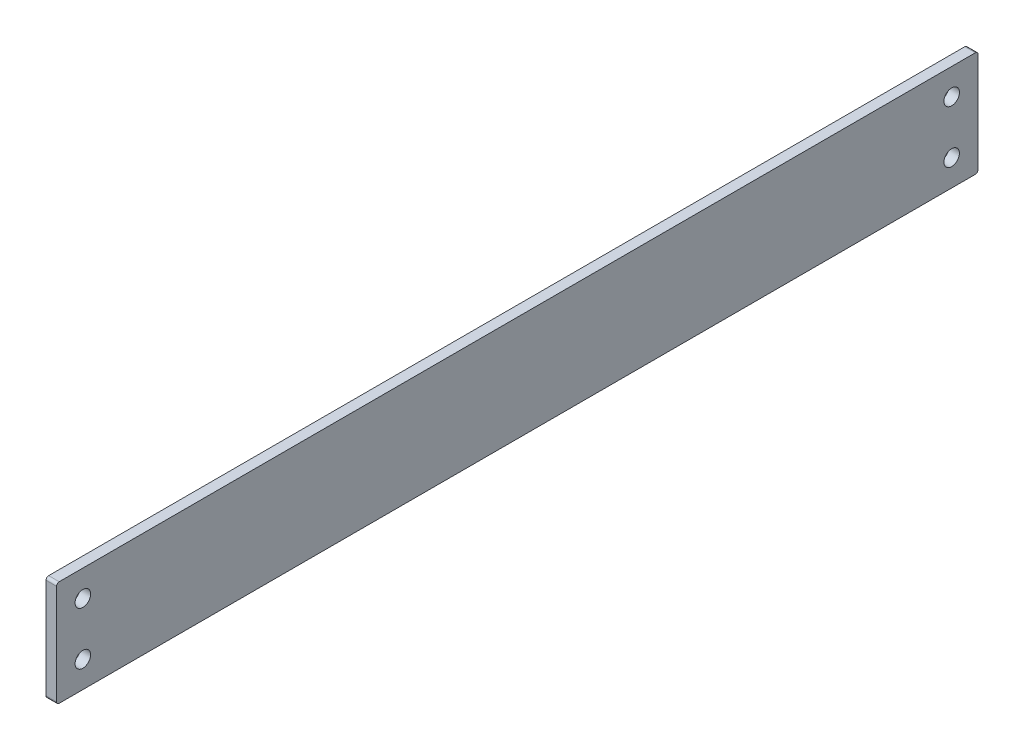
ISO-10303-21;
HEADER;
FILE_DESCRIPTION(('STEP AP214'),'2;1');
FILE_NAME('part.step','',(''),(''),'','','');
FILE_SCHEMA(('AUTOMOTIVE_DESIGN { 1 0 10303 214 1 1 1 1 }'));
ENDSEC;
DATA;
#1=APPLICATION_CONTEXT('core data for automotive mechanical design processes');
#2=APPLICATION_PROTOCOL_DEFINITION('international standard','automotive_design',2000,#1);
#3=PRODUCT_CONTEXT('',#1,'mechanical');
#4=PRODUCT('Part','Part','',(#3));
#5=PRODUCT_RELATED_PRODUCT_CATEGORY('part','',(#4));
#6=PRODUCT_DEFINITION_FORMATION('','',#4);
#7=PRODUCT_DEFINITION_CONTEXT('part definition',#1,'design');
#8=PRODUCT_DEFINITION('design','',#6,#7);
#9=PRODUCT_DEFINITION_SHAPE('','',#8);
#10=(LENGTH_UNIT() NAMED_UNIT(*) SI_UNIT(.MILLI.,.METRE.));
#11=(NAMED_UNIT(*) PLANE_ANGLE_UNIT() SI_UNIT($,.RADIAN.));
#12=(NAMED_UNIT(*) SI_UNIT($,.STERADIAN.) SOLID_ANGLE_UNIT());
#13=UNCERTAINTY_MEASURE_WITH_UNIT(LENGTH_MEASURE(1.E-05),#10,'distance_accuracy_value','');
#14=(GEOMETRIC_REPRESENTATION_CONTEXT(3) GLOBAL_UNCERTAINTY_ASSIGNED_CONTEXT((#13)) GLOBAL_UNIT_ASSIGNED_CONTEXT((#10,
#11,#12)) REPRESENTATION_CONTEXT('',''));
#15=CARTESIAN_POINT('',(0.,0.,0.));
#16=DIRECTION('',(0.,0.,1.));
#17=DIRECTION('',(1.,0.,0.));
#18=AXIS2_PLACEMENT_3D('',#15,#16,#17);
#19=CARTESIAN_POINT('',(4.,0.,0.));
#20=DIRECTION('',(-1.,0.,0.));
#21=DIRECTION('',(0.,0.,1.));
#22=AXIS2_PLACEMENT_3D('',#19,#20,#21);
#23=PLANE('',#22);
#24=DIRECTION('',(0.,0.,-1.));
#25=VECTOR('',#24,1.);
#26=CARTESIAN_POINT('',(4.,0.,0.));
#27=LINE('',#26,#25);
#28=CARTESIAN_POINT('',(4.,0.,-1.));
#29=VERTEX_POINT('',#28);
#30=CARTESIAN_POINT('',(4.,0.,-349.));
#31=VERTEX_POINT('',#30);
#32=EDGE_CURVE('E173',#29,#31,#27,.T.);
#33=ORIENTED_EDGE('',*,*,#32,.T.);
#34=CARTESIAN_POINT('',(4.,1.00000000000004,-349.));
#35=DIRECTION('',(-1.,0.,0.));
#36=DIRECTION('',(0.,0.,1.));
#37=AXIS2_PLACEMENT_3D('',#34,#35,#36);
#38=CIRCLE('',#37,1.);
#39=CARTESIAN_POINT('',(4.,1.00000000000004,-350.));
#40=VERTEX_POINT('',#39);
#41=EDGE_CURVE('E150',#31,#40,#38,.F.);
#42=ORIENTED_EDGE('',*,*,#41,.T.);
#43=DIRECTION('',(0.,1.,0.));
#44=VECTOR('',#43,1.);
#45=CARTESIAN_POINT('',(4.,0.,-350.));
#46=LINE('',#45,#44);
#47=CARTESIAN_POINT('',(4.,39.,-350.));
#48=VERTEX_POINT('',#47);
#49=EDGE_CURVE('E120',#40,#48,#46,.T.);
#50=ORIENTED_EDGE('',*,*,#49,.T.);
#51=CARTESIAN_POINT('',(4.,39.,-349.));
#52=DIRECTION('',(-1.,0.,0.));
#53=DIRECTION('',(0.,0.,1.));
#54=AXIS2_PLACEMENT_3D('',#51,#52,#53);
#55=CIRCLE('',#54,1.);
#56=CARTESIAN_POINT('',(4.,40.,-349.));
#57=VERTEX_POINT('',#56);
#58=EDGE_CURVE('E57',#48,#57,#55,.F.);
#59=ORIENTED_EDGE('',*,*,#58,.T.);
#60=DIRECTION('',(0.,0.,1.));
#61=VECTOR('',#60,1.);
#62=CARTESIAN_POINT('',(4.,40.,0.));
#63=LINE('',#62,#61);
#64=CARTESIAN_POINT('',(4.,40.,-1.));
#65=VERTEX_POINT('',#64);
#66=EDGE_CURVE('E136',#57,#65,#63,.T.);
#67=ORIENTED_EDGE('',*,*,#66,.T.);
#68=CARTESIAN_POINT('',(4.,39.,-1.));
#69=DIRECTION('',(-1.,0.,0.));
#70=DIRECTION('',(0.,0.,1.));
#71=AXIS2_PLACEMENT_3D('',#68,#69,#70);
#72=CIRCLE('',#71,1.);
#73=CARTESIAN_POINT('',(4.,39.,0.));
#74=VERTEX_POINT('',#73);
#75=EDGE_CURVE('E145',#65,#74,#72,.F.);
#76=ORIENTED_EDGE('',*,*,#75,.T.);
#77=DIRECTION('',(0.,-1.,0.));
#78=VECTOR('',#77,1.);
#79=CARTESIAN_POINT('',(4.,0.,0.));
#80=LINE('',#79,#78);
#81=CARTESIAN_POINT('',(4.,1.,0.));
#82=VERTEX_POINT('',#81);
#83=EDGE_CURVE('E130',#74,#82,#80,.T.);
#84=ORIENTED_EDGE('',*,*,#83,.T.);
#85=CARTESIAN_POINT('',(4.,1.,-1.));
#86=DIRECTION('',(-1.,0.,0.));
#87=DIRECTION('',(0.,0.,1.));
#88=AXIS2_PLACEMENT_3D('',#85,#86,#87);
#89=CIRCLE('',#88,1.);
#90=EDGE_CURVE('E147',#82,#29,#89,.F.);
#91=ORIENTED_EDGE('',*,*,#90,.T.);
#92=EDGE_LOOP('',(#33,#42,#50,#59,#67,#76,#84,#91));
#93=FACE_BOUND('',#92,.T.);
#94=CARTESIAN_POINT('',(4.,30.,-10.));
#95=DIRECTION('',(1.,0.,0.));
#96=DIRECTION('',(0.,0.,-1.));
#97=AXIS2_PLACEMENT_3D('',#94,#95,#96);
#98=CIRCLE('',#97,2.95);
#99=CARTESIAN_POINT('',(4.,30.,-12.95));
#100=VERTEX_POINT('',#99);
#101=EDGE_CURVE('E166',#100,#100,#98,.T.);
#102=ORIENTED_EDGE('',*,*,#101,.F.);
#103=EDGE_LOOP('',(#102));
#104=FACE_BOUND('',#103,.T.);
#105=CARTESIAN_POINT('',(4.,10.,-9.99999999999999));
#106=DIRECTION('',(1.,0.,0.));
#107=DIRECTION('',(0.,0.,-1.));
#108=AXIS2_PLACEMENT_3D('',#105,#106,#107);
#109=CIRCLE('',#108,2.95);
#110=CARTESIAN_POINT('',(4.,10.,-12.95));
#111=VERTEX_POINT('',#110);
#112=EDGE_CURVE('E178',#111,#111,#109,.T.);
#113=ORIENTED_EDGE('',*,*,#112,.F.);
#114=EDGE_LOOP('',(#113));
#115=FACE_BOUND('',#114,.T.);
#116=CARTESIAN_POINT('',(4.,10.,-340.));
#117=DIRECTION('',(1.,0.,0.));
#118=DIRECTION('',(0.,0.,1.));
#119=AXIS2_PLACEMENT_3D('',#116,#117,#118);
#120=CIRCLE('',#119,2.94999999999997);
#121=CARTESIAN_POINT('',(4.,10.,-337.05));
#122=VERTEX_POINT('',#121);
#123=EDGE_CURVE('E183',#122,#122,#120,.T.);
#124=ORIENTED_EDGE('',*,*,#123,.F.);
#125=EDGE_LOOP('',(#124));
#126=FACE_BOUND('',#125,.T.);
#127=CARTESIAN_POINT('',(4.,30.,-340.));
#128=DIRECTION('',(1.,0.,0.));
#129=DIRECTION('',(0.,0.,1.));
#130=AXIS2_PLACEMENT_3D('',#127,#128,#129);
#131=CIRCLE('',#130,2.95000000000002);
#132=CARTESIAN_POINT('',(4.,30.,-337.05));
#133=VERTEX_POINT('',#132);
#134=EDGE_CURVE('E189',#133,#133,#131,.T.);
#135=ORIENTED_EDGE('',*,*,#134,.F.);
#136=EDGE_LOOP('',(#135));
#137=FACE_BOUND('',#136,.T.);
#138=ADVANCED_FACE('F35',(#93,#104,#115,#126,#137),#23,.F.);
#139=CARTESIAN_POINT('',(0.,0.,0.));
#140=DIRECTION('',(-1.,0.,0.));
#141=DIRECTION('',(0.,0.,1.));
#142=AXIS2_PLACEMENT_3D('',#139,#140,#141);
#143=PLANE('',#142);
#144=CARTESIAN_POINT('',(0.,10.,-340.));
#145=DIRECTION('',(1.,0.,0.));
#146=DIRECTION('',(0.,0.,1.));
#147=AXIS2_PLACEMENT_3D('',#144,#145,#146);
#148=CIRCLE('',#147,2.94999999999997);
#149=CARTESIAN_POINT('',(0.,10.,-337.05));
#150=VERTEX_POINT('',#149);
#151=EDGE_CURVE('E186',#150,#150,#148,.T.);
#152=ORIENTED_EDGE('',*,*,#151,.T.);
#153=EDGE_LOOP('',(#152));
#154=FACE_BOUND('',#153,.T.);
#155=CARTESIAN_POINT('',(0.,30.,-10.));
#156=DIRECTION('',(1.,0.,0.));
#157=DIRECTION('',(0.,0.,-1.));
#158=AXIS2_PLACEMENT_3D('',#155,#156,#157);
#159=CIRCLE('',#158,2.95);
#160=CARTESIAN_POINT('',(0.,30.,-12.95));
#161=VERTEX_POINT('',#160);
#162=EDGE_CURVE('E168',#161,#161,#159,.T.);
#163=ORIENTED_EDGE('',*,*,#162,.T.);
#164=EDGE_LOOP('',(#163));
#165=FACE_BOUND('',#164,.T.);
#166=DIRECTION('',(0.,1.,0.));
#167=VECTOR('',#166,1.);
#168=CARTESIAN_POINT('',(0.,0.,-350.));
#169=LINE('',#168,#167);
#170=CARTESIAN_POINT('',(0.,1.00000000000004,-350.));
#171=VERTEX_POINT('',#170);
#172=CARTESIAN_POINT('',(0.,39.,-350.));
#173=VERTEX_POINT('',#172);
#174=EDGE_CURVE('E118',#171,#173,#169,.T.);
#175=ORIENTED_EDGE('',*,*,#174,.F.);
#176=CARTESIAN_POINT('',(0.,1.00000000000004,-349.));
#177=DIRECTION('',(-1.,0.,0.));
#178=DIRECTION('',(0.,0.,1.));
#179=AXIS2_PLACEMENT_3D('',#176,#177,#178);
#180=CIRCLE('',#179,1.);
#181=CARTESIAN_POINT('',(0.,0.,-349.));
#182=VERTEX_POINT('',#181);
#183=EDGE_CURVE('E101',#171,#182,#180,.T.);
#184=ORIENTED_EDGE('',*,*,#183,.T.);
#185=DIRECTION('',(0.,0.,-1.));
#186=VECTOR('',#185,1.);
#187=CARTESIAN_POINT('',(0.,0.,0.));
#188=LINE('',#187,#186);
#189=CARTESIAN_POINT('',(0.,0.,-1.));
#190=VERTEX_POINT('',#189);
#191=EDGE_CURVE('E128',#190,#182,#188,.T.);
#192=ORIENTED_EDGE('',*,*,#191,.F.);
#193=CARTESIAN_POINT('',(0.,1.,-1.));
#194=DIRECTION('',(-1.,0.,0.));
#195=DIRECTION('',(0.,0.,1.));
#196=AXIS2_PLACEMENT_3D('',#193,#194,#195);
#197=CIRCLE('',#196,1.);
#198=CARTESIAN_POINT('',(0.,1.,0.));
#199=VERTEX_POINT('',#198);
#200=EDGE_CURVE('E139',#190,#199,#197,.T.);
#201=ORIENTED_EDGE('',*,*,#200,.T.);
#202=DIRECTION('',(0.,-1.,0.));
#203=VECTOR('',#202,1.);
#204=CARTESIAN_POINT('',(0.,0.,0.));
#205=LINE('',#204,#203);
#206=CARTESIAN_POINT('',(0.,39.,0.));
#207=VERTEX_POINT('',#206);
#208=EDGE_CURVE('E132',#207,#199,#205,.T.);
#209=ORIENTED_EDGE('',*,*,#208,.F.);
#210=CARTESIAN_POINT('',(0.,39.,-1.));
#211=DIRECTION('',(-1.,0.,0.));
#212=DIRECTION('',(0.,0.,1.));
#213=AXIS2_PLACEMENT_3D('',#210,#211,#212);
#214=CIRCLE('',#213,1.);
#215=CARTESIAN_POINT('',(0.,40.,-1.));
#216=VERTEX_POINT('',#215);
#217=EDGE_CURVE('E121',#207,#216,#214,.T.);
#218=ORIENTED_EDGE('',*,*,#217,.T.);
#219=DIRECTION('',(0.,0.,1.));
#220=VECTOR('',#219,1.);
#221=CARTESIAN_POINT('',(0.,40.,0.));
#222=LINE('',#221,#220);
#223=CARTESIAN_POINT('',(0.,40.,-349.));
#224=VERTEX_POINT('',#223);
#225=EDGE_CURVE('E127',#224,#216,#222,.T.);
#226=ORIENTED_EDGE('',*,*,#225,.F.);
#227=CARTESIAN_POINT('',(0.,39.,-349.));
#228=DIRECTION('',(-1.,0.,0.));
#229=DIRECTION('',(0.,0.,1.));
#230=AXIS2_PLACEMENT_3D('',#227,#228,#229);
#231=CIRCLE('',#230,1.);
#232=EDGE_CURVE('E112',#224,#173,#231,.T.);
#233=ORIENTED_EDGE('',*,*,#232,.T.);
#234=EDGE_LOOP('',(#175,#184,#192,#201,#209,#218,#226,#233));
#235=FACE_BOUND('',#234,.T.);
#236=CARTESIAN_POINT('',(0.,10.,-9.99999999999999));
#237=DIRECTION('',(1.,0.,0.));
#238=DIRECTION('',(0.,0.,-1.));
#239=AXIS2_PLACEMENT_3D('',#236,#237,#238);
#240=CIRCLE('',#239,2.95);
#241=CARTESIAN_POINT('',(0.,10.,-12.95));
#242=VERTEX_POINT('',#241);
#243=EDGE_CURVE('E180',#242,#242,#240,.T.);
#244=ORIENTED_EDGE('',*,*,#243,.T.);
#245=EDGE_LOOP('',(#244));
#246=FACE_BOUND('',#245,.T.);
#247=CARTESIAN_POINT('',(0.,30.,-340.));
#248=DIRECTION('',(1.,0.,0.));
#249=DIRECTION('',(0.,0.,1.));
#250=AXIS2_PLACEMENT_3D('',#247,#248,#249);
#251=CIRCLE('',#250,2.95000000000002);
#252=CARTESIAN_POINT('',(0.,30.,-337.05));
#253=VERTEX_POINT('',#252);
#254=EDGE_CURVE('E192',#253,#253,#251,.T.);
#255=ORIENTED_EDGE('',*,*,#254,.T.);
#256=EDGE_LOOP('',(#255));
#257=FACE_BOUND('',#256,.T.);
#258=ADVANCED_FACE('F124',(#154,#165,#235,#246,#257),#143,.T.);
#259=CARTESIAN_POINT('',(4.,0.,0.));
#260=DIRECTION('',(0.,0.,-1.));
#261=DIRECTION('',(-1.,0.,0.));
#262=AXIS2_PLACEMENT_3D('',#259,#260,#261);
#263=PLANE('',#262);
#264=ORIENTED_EDGE('',*,*,#208,.T.);
#265=DIRECTION('',(-1.,0.,0.));
#266=VECTOR('',#265,1.);
#267=CARTESIAN_POINT('',(4.,1.,0.));
#268=LINE('',#267,#266);
#269=EDGE_CURVE('E11',#199,#82,#268,.F.);
#270=ORIENTED_EDGE('',*,*,#269,.T.);
#271=ORIENTED_EDGE('',*,*,#83,.F.);
#272=DIRECTION('',(-1.,0.,0.));
#273=VECTOR('',#272,1.);
#274=CARTESIAN_POINT('',(4.,39.,0.));
#275=LINE('',#274,#273);
#276=EDGE_CURVE('E43',#74,#207,#275,.T.);
#277=ORIENTED_EDGE('',*,*,#276,.T.);
#278=EDGE_LOOP('',(#264,#270,#271,#277));
#279=FACE_BOUND('',#278,.T.);
#280=ADVANCED_FACE('F161',(#279),#263,.F.);
#281=CARTESIAN_POINT('',(4.,0.,0.));
#282=DIRECTION('',(0.,1.,0.));
#283=DIRECTION('',(0.,0.,1.));
#284=AXIS2_PLACEMENT_3D('',#281,#282,#283);
#285=PLANE('',#284);
#286=ORIENTED_EDGE('',*,*,#191,.T.);
#287=DIRECTION('',(-1.,0.,0.));
#288=VECTOR('',#287,1.);
#289=CARTESIAN_POINT('',(4.,0.,-349.));
#290=LINE('',#289,#288);
#291=EDGE_CURVE('E106',#182,#31,#290,.F.);
#292=ORIENTED_EDGE('',*,*,#291,.T.);
#293=ORIENTED_EDGE('',*,*,#32,.F.);
#294=DIRECTION('',(-1.,0.,0.));
#295=VECTOR('',#294,1.);
#296=CARTESIAN_POINT('',(4.,0.,-1.));
#297=LINE('',#296,#295);
#298=EDGE_CURVE('E111',#29,#190,#297,.T.);
#299=ORIENTED_EDGE('',*,*,#298,.T.);
#300=EDGE_LOOP('',(#286,#292,#293,#299));
#301=FACE_BOUND('',#300,.T.);
#302=ADVANCED_FACE('F218',(#301),#285,.F.);
#303=CARTESIAN_POINT('',(4.,0.,-350.));
#304=DIRECTION('',(0.,0.,1.));
#305=DIRECTION('',(1.,0.,0.));
#306=AXIS2_PLACEMENT_3D('',#303,#304,#305);
#307=PLANE('',#306);
#308=ORIENTED_EDGE('',*,*,#49,.F.);
#309=DIRECTION('',(-1.,0.,0.));
#310=VECTOR('',#309,1.);
#311=CARTESIAN_POINT('',(4.,1.00000000000004,-350.));
#312=LINE('',#311,#310);
#313=EDGE_CURVE('E105',#40,#171,#312,.T.);
#314=ORIENTED_EDGE('',*,*,#313,.T.);
#315=ORIENTED_EDGE('',*,*,#174,.T.);
#316=DIRECTION('',(-1.,0.,0.));
#317=VECTOR('',#316,1.);
#318=CARTESIAN_POINT('',(4.,39.,-350.));
#319=LINE('',#318,#317);
#320=EDGE_CURVE('E122',#173,#48,#319,.F.);
#321=ORIENTED_EDGE('',*,*,#320,.T.);
#322=EDGE_LOOP('',(#308,#314,#315,#321));
#323=FACE_BOUND('',#322,.T.);
#324=ADVANCED_FACE('F117',(#323),#307,.F.);
#325=CARTESIAN_POINT('',(4.,40.,0.));
#326=DIRECTION('',(0.,-1.,0.));
#327=DIRECTION('',(0.,0.,-1.));
#328=AXIS2_PLACEMENT_3D('',#325,#326,#327);
#329=PLANE('',#328);
#330=ORIENTED_EDGE('',*,*,#66,.F.);
#331=DIRECTION('',(-1.,0.,0.));
#332=VECTOR('',#331,1.);
#333=CARTESIAN_POINT('',(4.,40.,-349.));
#334=LINE('',#333,#332);
#335=EDGE_CURVE('E153',#57,#224,#334,.T.);
#336=ORIENTED_EDGE('',*,*,#335,.T.);
#337=ORIENTED_EDGE('',*,*,#225,.T.);
#338=DIRECTION('',(-1.,0.,0.));
#339=VECTOR('',#338,1.);
#340=CARTESIAN_POINT('',(4.,40.,-1.));
#341=LINE('',#340,#339);
#342=EDGE_CURVE('E50',#216,#65,#341,.F.);
#343=ORIENTED_EDGE('',*,*,#342,.T.);
#344=EDGE_LOOP('',(#330,#336,#337,#343));
#345=FACE_BOUND('',#344,.T.);
#346=ADVANCED_FACE('F213',(#345),#329,.F.);
#347=CARTESIAN_POINT('',(4.,30.,-10.));
#348=DIRECTION('',(-1.,0.,0.));
#349=DIRECTION('',(0.,0.,1.));
#350=AXIS2_PLACEMENT_3D('',#347,#348,#349);
#351=CYLINDRICAL_SURFACE('',#350,2.95);
#352=ORIENTED_EDGE('',*,*,#101,.T.);
#353=EDGE_LOOP('',(#352));
#354=FACE_BOUND('',#353,.T.);
#355=ORIENTED_EDGE('',*,*,#162,.F.);
#356=EDGE_LOOP('',(#355));
#357=FACE_BOUND('',#356,.T.);
#358=ADVANCED_FACE('F210',(#354,#357),#351,.F.);
#359=CARTESIAN_POINT('',(4.,10.,-9.99999999999999));
#360=DIRECTION('',(-1.,0.,0.));
#361=DIRECTION('',(0.,0.,1.));
#362=AXIS2_PLACEMENT_3D('',#359,#360,#361);
#363=CYLINDRICAL_SURFACE('',#362,2.95);
#364=ORIENTED_EDGE('',*,*,#112,.T.);
#365=EDGE_LOOP('',(#364));
#366=FACE_BOUND('',#365,.T.);
#367=ORIENTED_EDGE('',*,*,#243,.F.);
#368=EDGE_LOOP('',(#367));
#369=FACE_BOUND('',#368,.T.);
#370=ADVANCED_FACE('F311',(#366,#369),#363,.F.);
#371=CARTESIAN_POINT('',(4.,10.,-340.));
#372=DIRECTION('',(-1.,0.,0.));
#373=DIRECTION('',(0.,0.,1.));
#374=AXIS2_PLACEMENT_3D('',#371,#372,#373);
#375=CYLINDRICAL_SURFACE('',#374,2.94999999999997);
#376=ORIENTED_EDGE('',*,*,#123,.T.);
#377=EDGE_LOOP('',(#376));
#378=FACE_BOUND('',#377,.T.);
#379=ORIENTED_EDGE('',*,*,#151,.F.);
#380=EDGE_LOOP('',(#379));
#381=FACE_BOUND('',#380,.T.);
#382=ADVANCED_FACE('F302',(#378,#381),#375,.F.);
#383=CARTESIAN_POINT('',(4.,30.,-340.));
#384=DIRECTION('',(-1.,0.,0.));
#385=DIRECTION('',(0.,0.,1.));
#386=AXIS2_PLACEMENT_3D('',#383,#384,#385);
#387=CYLINDRICAL_SURFACE('',#386,2.95000000000002);
#388=ORIENTED_EDGE('',*,*,#134,.T.);
#389=EDGE_LOOP('',(#388));
#390=FACE_BOUND('',#389,.T.);
#391=ORIENTED_EDGE('',*,*,#254,.F.);
#392=EDGE_LOOP('',(#391));
#393=FACE_BOUND('',#392,.T.);
#394=ADVANCED_FACE('F198',(#390,#393),#387,.F.);
#395=CARTESIAN_POINT('',(4.,1.00000000000004,-349.));
#396=DIRECTION('',(-1.,0.,0.));
#397=DIRECTION('',(0.,0.,1.));
#398=AXIS2_PLACEMENT_3D('',#395,#396,#397);
#399=CYLINDRICAL_SURFACE('',#398,1.);
#400=ORIENTED_EDGE('',*,*,#41,.F.);
#401=ORIENTED_EDGE('',*,*,#291,.F.);
#402=ORIENTED_EDGE('',*,*,#183,.F.);
#403=ORIENTED_EDGE('',*,*,#313,.F.);
#404=EDGE_LOOP('',(#400,#401,#402,#403));
#405=FACE_BOUND('',#404,.T.);
#406=ADVANCED_FACE('F104',(#405),#399,.T.);
#407=CARTESIAN_POINT('',(4.,39.,-349.));
#408=DIRECTION('',(-1.,0.,0.));
#409=DIRECTION('',(0.,0.,1.));
#410=AXIS2_PLACEMENT_3D('',#407,#408,#409);
#411=CYLINDRICAL_SURFACE('',#410,1.);
#412=ORIENTED_EDGE('',*,*,#58,.F.);
#413=ORIENTED_EDGE('',*,*,#320,.F.);
#414=ORIENTED_EDGE('',*,*,#232,.F.);
#415=ORIENTED_EDGE('',*,*,#335,.F.);
#416=EDGE_LOOP('',(#412,#413,#414,#415));
#417=FACE_BOUND('',#416,.T.);
#418=ADVANCED_FACE('F226',(#417),#411,.T.);
#419=CARTESIAN_POINT('',(4.,1.,-1.));
#420=DIRECTION('',(-1.,0.,0.));
#421=DIRECTION('',(0.,0.,1.));
#422=AXIS2_PLACEMENT_3D('',#419,#420,#421);
#423=CYLINDRICAL_SURFACE('',#422,1.);
#424=ORIENTED_EDGE('',*,*,#90,.F.);
#425=ORIENTED_EDGE('',*,*,#269,.F.);
#426=ORIENTED_EDGE('',*,*,#200,.F.);
#427=ORIENTED_EDGE('',*,*,#298,.F.);
#428=EDGE_LOOP('',(#424,#425,#426,#427));
#429=FACE_BOUND('',#428,.T.);
#430=ADVANCED_FACE('F228',(#429),#423,.T.);
#431=CARTESIAN_POINT('',(4.,39.,-1.));
#432=DIRECTION('',(-1.,0.,0.));
#433=DIRECTION('',(0.,0.,1.));
#434=AXIS2_PLACEMENT_3D('',#431,#432,#433);
#435=CYLINDRICAL_SURFACE('',#434,1.);
#436=ORIENTED_EDGE('',*,*,#75,.F.);
#437=ORIENTED_EDGE('',*,*,#342,.F.);
#438=ORIENTED_EDGE('',*,*,#217,.F.);
#439=ORIENTED_EDGE('',*,*,#276,.F.);
#440=EDGE_LOOP('',(#436,#437,#438,#439));
#441=FACE_BOUND('',#440,.T.);
#442=ADVANCED_FACE('F37',(#441),#435,.T.);
#443=CLOSED_SHELL('',(#138,#258,#280,#302,#324,#346,#358,#370,#382,#394,#406,#418,#430,#442));
#444=MANIFOLD_SOLID_BREP('B2',#443);
#445=ADVANCED_BREP_SHAPE_REPRESENTATION('',(#18,#444),#14);
#446=SHAPE_DEFINITION_REPRESENTATION(#9,#445);
ENDSEC;
END-ISO-10303-21;
